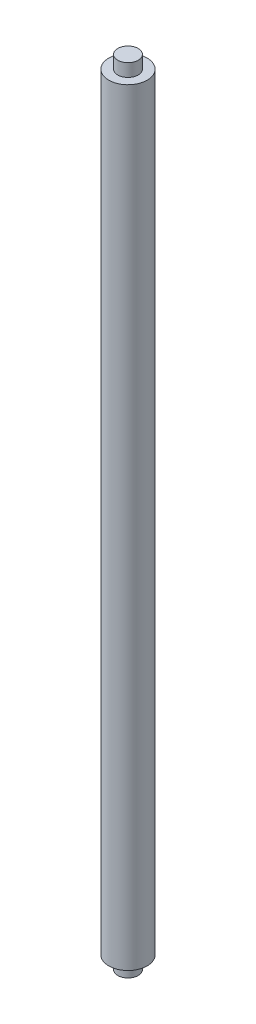
ISO-10303-21;
HEADER;
FILE_DESCRIPTION(('STEP AP214'),'2;1');
FILE_NAME('part.step','',(''),(''),'','','');
FILE_SCHEMA(('AUTOMOTIVE_DESIGN { 1 0 10303 214 1 1 1 1 }'));
ENDSEC;
DATA;
#1=APPLICATION_CONTEXT('core data for automotive mechanical design processes');
#2=APPLICATION_PROTOCOL_DEFINITION('international standard','automotive_design',2000,#1);
#3=PRODUCT_CONTEXT('',#1,'mechanical');
#4=PRODUCT('Part','Part','',(#3));
#5=PRODUCT_RELATED_PRODUCT_CATEGORY('part','',(#4));
#6=PRODUCT_DEFINITION_FORMATION('','',#4);
#7=PRODUCT_DEFINITION_CONTEXT('part definition',#1,'design');
#8=PRODUCT_DEFINITION('design','',#6,#7);
#9=PRODUCT_DEFINITION_SHAPE('','',#8);
#10=(LENGTH_UNIT() NAMED_UNIT(*) SI_UNIT(.MILLI.,.METRE.));
#11=(NAMED_UNIT(*) PLANE_ANGLE_UNIT() SI_UNIT($,.RADIAN.));
#12=(NAMED_UNIT(*) SI_UNIT($,.STERADIAN.) SOLID_ANGLE_UNIT());
#13=UNCERTAINTY_MEASURE_WITH_UNIT(LENGTH_MEASURE(1.E-05),#10,'distance_accuracy_value','');
#14=(GEOMETRIC_REPRESENTATION_CONTEXT(3) GLOBAL_UNCERTAINTY_ASSIGNED_CONTEXT((#13)) GLOBAL_UNIT_ASSIGNED_CONTEXT((#10,
#11,#12)) REPRESENTATION_CONTEXT('',''));
#15=CARTESIAN_POINT('',(0.,0.,0.));
#16=DIRECTION('',(0.,0.,1.));
#17=DIRECTION('',(1.,0.,0.));
#18=AXIS2_PLACEMENT_3D('',#15,#16,#17);
#19=CARTESIAN_POINT('',(0.,31.,0.));
#20=DIRECTION('',(0.,-1.,0.));
#21=DIRECTION('',(0.,0.,-1.));
#22=AXIS2_PLACEMENT_3D('',#19,#20,#21);
#23=CYLINDRICAL_SURFACE('',#22,0.8);
#24=CARTESIAN_POINT('',(0.,30.,0.));
#25=DIRECTION('',(0.,1.,0.));
#26=DIRECTION('',(0.,0.,1.));
#27=AXIS2_PLACEMENT_3D('',#24,#25,#26);
#28=CIRCLE('',#27,0.8);
#29=CARTESIAN_POINT('',(0.,30.,0.8));
#30=VERTEX_POINT('',#29);
#31=EDGE_CURVE('E37',#30,#30,#28,.T.);
#32=ORIENTED_EDGE('',*,*,#31,.T.);
#33=EDGE_LOOP('',(#32));
#34=FACE_BOUND('',#33,.T.);
#35=CARTESIAN_POINT('',(0.,31.,0.));
#36=DIRECTION('',(0.,1.,0.));
#37=DIRECTION('',(0.,0.,1.));
#38=AXIS2_PLACEMENT_3D('',#35,#36,#37);
#39=CIRCLE('',#38,0.8);
#40=CARTESIAN_POINT('',(0.,31.,0.8));
#41=VERTEX_POINT('',#40);
#42=EDGE_CURVE('E41',#41,#41,#39,.T.);
#43=ORIENTED_EDGE('',*,*,#42,.F.);
#44=EDGE_LOOP('',(#43));
#45=FACE_BOUND('',#44,.T.);
#46=ADVANCED_FACE('F34',(#34,#45),#23,.T.);
#47=CARTESIAN_POINT('',(0.,31.,0.));
#48=DIRECTION('',(0.,1.,0.));
#49=DIRECTION('',(0.,0.,1.));
#50=AXIS2_PLACEMENT_3D('',#47,#48,#49);
#51=PLANE('',#50);
#52=ORIENTED_EDGE('',*,*,#42,.T.);
#53=EDGE_LOOP('',(#52));
#54=FACE_BOUND('',#53,.T.);
#55=ADVANCED_FACE('F73',(#54),#51,.T.);
#56=CARTESIAN_POINT('',(0.,30.,0.));
#57=DIRECTION('',(0.,-1.,0.));
#58=DIRECTION('',(0.,0.,-1.));
#59=AXIS2_PLACEMENT_3D('',#56,#57,#58);
#60=CYLINDRICAL_SURFACE('',#59,1.5);
#61=CARTESIAN_POINT('',(0.,30.,0.));
#62=DIRECTION('',(0.,1.,0.));
#63=DIRECTION('',(0.,0.,1.));
#64=AXIS2_PLACEMENT_3D('',#61,#62,#63);
#65=CIRCLE('',#64,1.5);
#66=CARTESIAN_POINT('',(0.,30.,1.5));
#67=VERTEX_POINT('',#66);
#68=EDGE_CURVE('E53',#67,#67,#65,.T.);
#69=ORIENTED_EDGE('',*,*,#68,.F.);
#70=EDGE_LOOP('',(#69));
#71=FACE_BOUND('',#70,.T.);
#72=CARTESIAN_POINT('',(0.,-30.,0.));
#73=DIRECTION('',(0.,1.,0.));
#74=DIRECTION('',(0.,0.,1.));
#75=AXIS2_PLACEMENT_3D('',#72,#73,#74);
#76=CIRCLE('',#75,1.5);
#77=CARTESIAN_POINT('',(0.,-30.,1.5));
#78=VERTEX_POINT('',#77);
#79=EDGE_CURVE('E50',#78,#78,#76,.T.);
#80=ORIENTED_EDGE('',*,*,#79,.T.);
#81=EDGE_LOOP('',(#80));
#82=FACE_BOUND('',#81,.T.);
#83=ADVANCED_FACE('F65',(#71,#82),#60,.T.);
#84=CARTESIAN_POINT('',(0.,30.,0.));
#85=DIRECTION('',(0.,1.,0.));
#86=DIRECTION('',(0.,0.,1.));
#87=AXIS2_PLACEMENT_3D('',#84,#85,#86);
#88=PLANE('',#87);
#89=ORIENTED_EDGE('',*,*,#31,.F.);
#90=EDGE_LOOP('',(#89));
#91=FACE_BOUND('',#90,.T.);
#92=ORIENTED_EDGE('',*,*,#68,.T.);
#93=EDGE_LOOP('',(#92));
#94=FACE_BOUND('',#93,.T.);
#95=ADVANCED_FACE('F62',(#91,#94),#88,.T.);
#96=CARTESIAN_POINT('',(0.,-30.,0.));
#97=DIRECTION('',(0.,1.,0.));
#98=DIRECTION('',(0.,0.,1.));
#99=AXIS2_PLACEMENT_3D('',#96,#97,#98);
#100=PLANE('',#99);
#101=CARTESIAN_POINT('',(0.,-30.,0.));
#102=DIRECTION('',(0.,1.,0.));
#103=DIRECTION('',(0.,0.,1.));
#104=AXIS2_PLACEMENT_3D('',#101,#102,#103);
#105=CIRCLE('',#104,0.8);
#106=CARTESIAN_POINT('',(0.,-30.,0.8));
#107=VERTEX_POINT('',#106);
#108=EDGE_CURVE('E10',#107,#107,#105,.T.);
#109=ORIENTED_EDGE('',*,*,#108,.T.);
#110=EDGE_LOOP('',(#109));
#111=FACE_BOUND('',#110,.T.);
#112=ORIENTED_EDGE('',*,*,#79,.F.);
#113=EDGE_LOOP('',(#112));
#114=FACE_BOUND('',#113,.T.);
#115=ADVANCED_FACE('F64',(#111,#114),#100,.F.);
#116=CARTESIAN_POINT('',(0.,-31.,0.));
#117=DIRECTION('',(0.,1.,0.));
#118=DIRECTION('',(0.,0.,1.));
#119=AXIS2_PLACEMENT_3D('',#116,#117,#118);
#120=PLANE('',#119);
#121=CARTESIAN_POINT('',(0.,-31.,0.));
#122=DIRECTION('',(0.,1.,0.));
#123=DIRECTION('',(0.,0.,1.));
#124=AXIS2_PLACEMENT_3D('',#121,#122,#123);
#125=CIRCLE('',#124,0.8);
#126=CARTESIAN_POINT('',(0.,-31.,0.8));
#127=VERTEX_POINT('',#126);
#128=EDGE_CURVE('E45',#127,#127,#125,.T.);
#129=ORIENTED_EDGE('',*,*,#128,.F.);
#130=EDGE_LOOP('',(#129));
#131=FACE_BOUND('',#130,.T.);
#132=ADVANCED_FACE('F71',(#131),#120,.F.);
#133=ORIENTED_EDGE('',*,*,#128,.T.);
#134=EDGE_LOOP('',(#133));
#135=FACE_BOUND('',#134,.T.);
#136=ORIENTED_EDGE('',*,*,#108,.F.);
#137=EDGE_LOOP('',(#136));
#138=FACE_BOUND('',#137,.T.);
#139=ADVANCED_FACE('F77',(#135,#138),#23,.T.);
#140=CLOSED_SHELL('',(#46,#55,#83,#95,#115,#132,#139));
#141=MANIFOLD_SOLID_BREP('B2',#140);
#142=ADVANCED_BREP_SHAPE_REPRESENTATION('',(#18,#141),#14);
#143=SHAPE_DEFINITION_REPRESENTATION(#9,#142);
ENDSEC;
END-ISO-10303-21;
